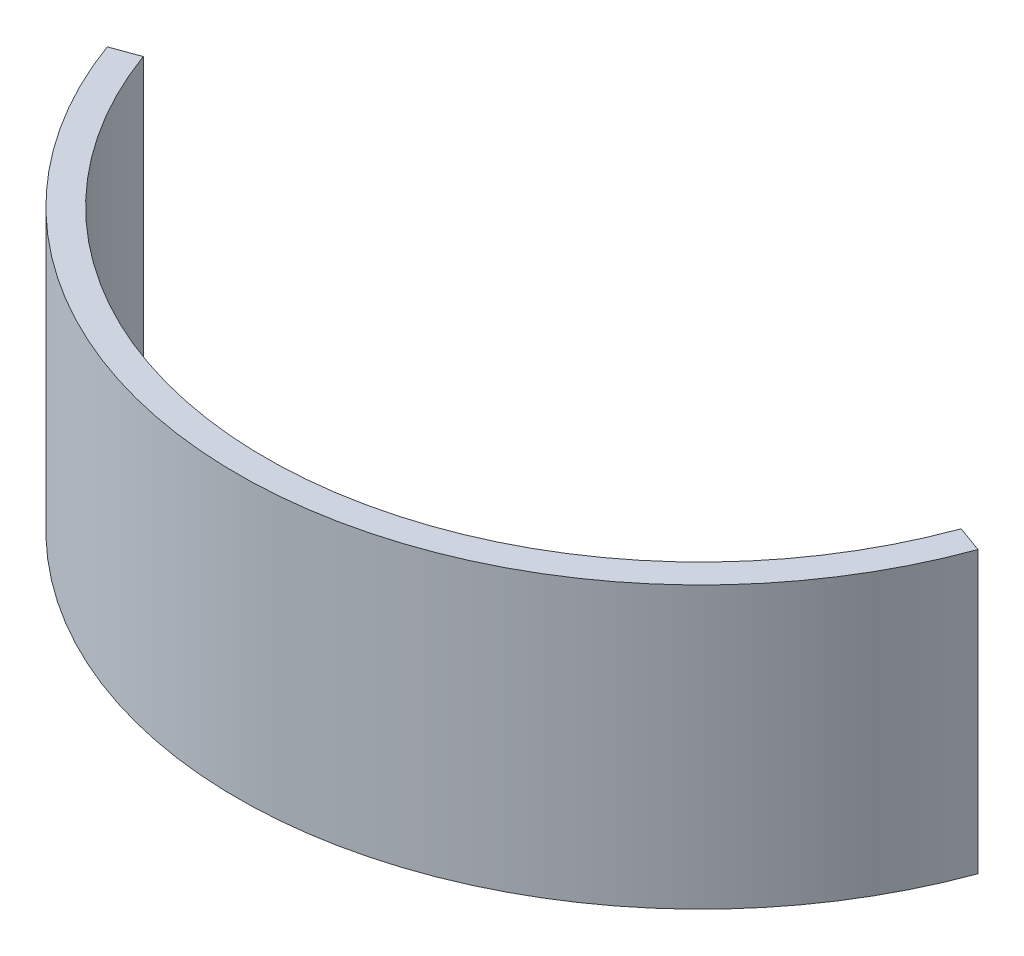
ISO-10303-21;
HEADER;
FILE_DESCRIPTION(('STEP AP214'),'2;1');
FILE_NAME('part.step','',(''),(''),'','','');
FILE_SCHEMA(('AUTOMOTIVE_DESIGN { 1 0 10303 214 1 1 1 1 }'));
ENDSEC;
DATA;
#1=APPLICATION_CONTEXT('core data for automotive mechanical design processes');
#2=APPLICATION_PROTOCOL_DEFINITION('international standard','automotive_design',2000,#1);
#3=PRODUCT_CONTEXT('',#1,'mechanical');
#4=PRODUCT('Part','Part','',(#3));
#5=PRODUCT_RELATED_PRODUCT_CATEGORY('part','',(#4));
#6=PRODUCT_DEFINITION_FORMATION('','',#4);
#7=PRODUCT_DEFINITION_CONTEXT('part definition',#1,'design');
#8=PRODUCT_DEFINITION('design','',#6,#7);
#9=PRODUCT_DEFINITION_SHAPE('','',#8);
#10=(LENGTH_UNIT() NAMED_UNIT(*) SI_UNIT(.MILLI.,.METRE.));
#11=(NAMED_UNIT(*) PLANE_ANGLE_UNIT() SI_UNIT($,.RADIAN.));
#12=(NAMED_UNIT(*) SI_UNIT($,.STERADIAN.) SOLID_ANGLE_UNIT());
#13=UNCERTAINTY_MEASURE_WITH_UNIT(LENGTH_MEASURE(1.E-05),#10,'distance_accuracy_value','');
#14=(GEOMETRIC_REPRESENTATION_CONTEXT(3) GLOBAL_UNCERTAINTY_ASSIGNED_CONTEXT((#13)) GLOBAL_UNIT_ASSIGNED_CONTEXT((#10,
#11,#12)) REPRESENTATION_CONTEXT('',''));
#15=CARTESIAN_POINT('',(0.,0.,0.));
#16=DIRECTION('',(0.,0.,1.));
#17=DIRECTION('',(1.,0.,0.));
#18=AXIS2_PLACEMENT_3D('',#15,#16,#17);
#19=CARTESIAN_POINT('',(0.,20.,0.));
#20=DIRECTION('',(0.,-1.,0.));
#21=DIRECTION('',(0.,0.,-1.));
#22=AXIS2_PLACEMENT_3D('',#19,#20,#21);
#23=CYLINDRICAL_SURFACE('',#22,33.);
#24=CARTESIAN_POINT('',(0.,0.,0.));
#25=DIRECTION('',(0.,1.,0.));
#26=DIRECTION('',(0.,0.,1.));
#27=AXIS2_PLACEMENT_3D('',#24,#25,#26);
#28=CIRCLE('',#27,33.);
#29=CARTESIAN_POINT('',(-31.009856485935,0.,11.286664729747));
#30=VERTEX_POINT('',#29);
#31=CARTESIAN_POINT('',(31.009856485935,0.,11.286664729747));
#32=VERTEX_POINT('',#31);
#33=EDGE_CURVE('E95',#30,#32,#28,.T.);
#34=ORIENTED_EDGE('',*,*,#33,.T.);
#35=DIRECTION('',(0.,-1.,0.));
#36=VECTOR('',#35,1.);
#37=CARTESIAN_POINT('',(31.009856485935,20.,11.286664729747));
#38=LINE('',#37,#36);
#39=CARTESIAN_POINT('',(31.009856485935,20.,11.286664729747));
#40=VERTEX_POINT('',#39);
#41=EDGE_CURVE('E11',#40,#32,#38,.T.);
#42=ORIENTED_EDGE('',*,*,#41,.F.);
#43=CARTESIAN_POINT('',(0.,20.,0.));
#44=DIRECTION('',(0.,1.,0.));
#45=DIRECTION('',(0.,0.,1.));
#46=AXIS2_PLACEMENT_3D('',#43,#44,#45);
#47=CIRCLE('',#46,33.);
#48=CARTESIAN_POINT('',(-31.009856485935,20.,11.286664729747));
#49=VERTEX_POINT('',#48);
#50=EDGE_CURVE('E72',#49,#40,#47,.T.);
#51=ORIENTED_EDGE('',*,*,#50,.F.);
#52=DIRECTION('',(0.,-1.,0.));
#53=VECTOR('',#52,1.);
#54=CARTESIAN_POINT('',(-31.009856485935,20.,11.286664729747));
#55=LINE('',#54,#53);
#56=EDGE_CURVE('E48',#49,#30,#55,.T.);
#57=ORIENTED_EDGE('',*,*,#56,.T.);
#58=EDGE_LOOP('',(#34,#42,#51,#57));
#59=FACE_BOUND('',#58,.T.);
#60=ADVANCED_FACE('F32',(#59),#23,.T.);
#61=CARTESIAN_POINT('',(29.1304712443632,20.,10.6026244430956));
#62=DIRECTION('',(0.342020143325662,0.,-0.939692620785911));
#63=DIRECTION('',(-0.939692620785911,0.,-0.342020143325662));
#64=AXIS2_PLACEMENT_3D('',#61,#62,#63);
#65=PLANE('',#64);
#66=DIRECTION('',(0.939692620785911,0.,0.342020143325662));
#67=VECTOR('',#66,1.);
#68=CARTESIAN_POINT('',(29.1304712443632,0.,10.6026244430956));
#69=LINE('',#68,#67);
#70=CARTESIAN_POINT('',(29.1304712443632,0.,10.6026244430956));
#71=VERTEX_POINT('',#70);
#72=EDGE_CURVE('E81',#71,#32,#69,.T.);
#73=ORIENTED_EDGE('',*,*,#72,.F.);
#74=DIRECTION('',(0.,-1.,0.));
#75=VECTOR('',#74,1.);
#76=CARTESIAN_POINT('',(29.1304712443632,20.,10.6026244430956));
#77=LINE('',#76,#75);
#78=CARTESIAN_POINT('',(29.1304712443632,20.,10.6026244430956));
#79=VERTEX_POINT('',#78);
#80=EDGE_CURVE('E40',#79,#71,#77,.T.);
#81=ORIENTED_EDGE('',*,*,#80,.F.);
#82=DIRECTION('',(0.939692620785911,0.,0.342020143325662));
#83=VECTOR('',#82,1.);
#84=CARTESIAN_POINT('',(29.1304712443632,20.,10.6026244430956));
#85=LINE('',#84,#83);
#86=EDGE_CURVE('E79',#79,#40,#85,.T.);
#87=ORIENTED_EDGE('',*,*,#86,.T.);
#88=ORIENTED_EDGE('',*,*,#41,.T.);
#89=EDGE_LOOP('',(#73,#81,#87,#88));
#90=FACE_BOUND('',#89,.T.);
#91=ADVANCED_FACE('F78',(#90),#65,.T.);
#92=CARTESIAN_POINT('',(0.,20.,0.));
#93=DIRECTION('',(0.,-1.,0.));
#94=DIRECTION('',(0.,0.,-1.));
#95=AXIS2_PLACEMENT_3D('',#92,#93,#94);
#96=CYLINDRICAL_SURFACE('',#95,31.);
#97=CARTESIAN_POINT('',(0.,0.,0.));
#98=DIRECTION('',(0.,1.,0.));
#99=DIRECTION('',(1.,0.,0.));
#100=AXIS2_PLACEMENT_3D('',#97,#98,#99);
#101=CIRCLE('',#100,31.);
#102=CARTESIAN_POINT('',(-29.1304712443632,0.,10.6026244430956));
#103=VERTEX_POINT('',#102);
#104=EDGE_CURVE('E98',#103,#71,#101,.T.);
#105=ORIENTED_EDGE('',*,*,#104,.F.);
#106=DIRECTION('',(0.,-1.,0.));
#107=VECTOR('',#106,1.);
#108=CARTESIAN_POINT('',(-29.1304712443632,20.,10.6026244430956));
#109=LINE('',#108,#107);
#110=CARTESIAN_POINT('',(-29.1304712443632,20.,10.6026244430956));
#111=VERTEX_POINT('',#110);
#112=EDGE_CURVE('E61',#111,#103,#109,.T.);
#113=ORIENTED_EDGE('',*,*,#112,.F.);
#114=CARTESIAN_POINT('',(0.,20.,0.));
#115=DIRECTION('',(0.,1.,0.));
#116=DIRECTION('',(1.,0.,0.));
#117=AXIS2_PLACEMENT_3D('',#114,#115,#116);
#118=CIRCLE('',#117,31.);
#119=EDGE_CURVE('E87',#111,#79,#118,.T.);
#120=ORIENTED_EDGE('',*,*,#119,.T.);
#121=ORIENTED_EDGE('',*,*,#80,.T.);
#122=EDGE_LOOP('',(#105,#113,#120,#121));
#123=FACE_BOUND('',#122,.T.);
#124=ADVANCED_FACE('F89',(#123),#96,.F.);
#125=CARTESIAN_POINT('',(-31.009856485935,20.,11.286664729747));
#126=DIRECTION('',(-0.34202014332567,0.,-0.939692620785908));
#127=DIRECTION('',(-0.939692620785908,0.,0.34202014332567));
#128=AXIS2_PLACEMENT_3D('',#125,#126,#127);
#129=PLANE('',#128);
#130=DIRECTION('',(0.939692620785908,0.,-0.34202014332567));
#131=VECTOR('',#130,1.);
#132=CARTESIAN_POINT('',(-31.009856485935,0.,11.286664729747));
#133=LINE('',#132,#131);
#134=EDGE_CURVE('E100',#30,#103,#133,.T.);
#135=ORIENTED_EDGE('',*,*,#134,.F.);
#136=ORIENTED_EDGE('',*,*,#56,.F.);
#137=DIRECTION('',(0.939692620785908,0.,-0.34202014332567));
#138=VECTOR('',#137,1.);
#139=CARTESIAN_POINT('',(-31.009856485935,20.,11.286664729747));
#140=LINE('',#139,#138);
#141=EDGE_CURVE('E90',#49,#111,#140,.T.);
#142=ORIENTED_EDGE('',*,*,#141,.T.);
#143=ORIENTED_EDGE('',*,*,#112,.T.);
#144=EDGE_LOOP('',(#135,#136,#142,#143));
#145=FACE_BOUND('',#144,.T.);
#146=ADVANCED_FACE('F106',(#145),#129,.T.);
#147=CARTESIAN_POINT('',(0.,20.,0.));
#148=DIRECTION('',(0.,1.,0.));
#149=DIRECTION('',(1.,0.,0.));
#150=AXIS2_PLACEMENT_3D('',#147,#148,#149);
#151=PLANE('',#150);
#152=ORIENTED_EDGE('',*,*,#50,.T.);
#153=ORIENTED_EDGE('',*,*,#86,.F.);
#154=ORIENTED_EDGE('',*,*,#119,.F.);
#155=ORIENTED_EDGE('',*,*,#141,.F.);
#156=EDGE_LOOP('',(#152,#153,#154,#155));
#157=FACE_BOUND('',#156,.T.);
#158=ADVANCED_FACE('F86',(#157),#151,.T.);
#159=CARTESIAN_POINT('',(0.,0.,0.));
#160=DIRECTION('',(0.,1.,0.));
#161=DIRECTION('',(1.,0.,0.));
#162=AXIS2_PLACEMENT_3D('',#159,#160,#161);
#163=PLANE('',#162);
#164=ORIENTED_EDGE('',*,*,#33,.F.);
#165=ORIENTED_EDGE('',*,*,#134,.T.);
#166=ORIENTED_EDGE('',*,*,#104,.T.);
#167=ORIENTED_EDGE('',*,*,#72,.T.);
#168=EDGE_LOOP('',(#164,#165,#166,#167));
#169=FACE_BOUND('',#168,.T.);
#170=ADVANCED_FACE('F105',(#169),#163,.F.);
#171=CLOSED_SHELL('',(#60,#91,#124,#146,#158,#170));
#172=MANIFOLD_SOLID_BREP('B2',#171);
#173=ADVANCED_BREP_SHAPE_REPRESENTATION('',(#18,#172),#14);
#174=SHAPE_DEFINITION_REPRESENTATION(#9,#173);
ENDSEC;
END-ISO-10303-21;
